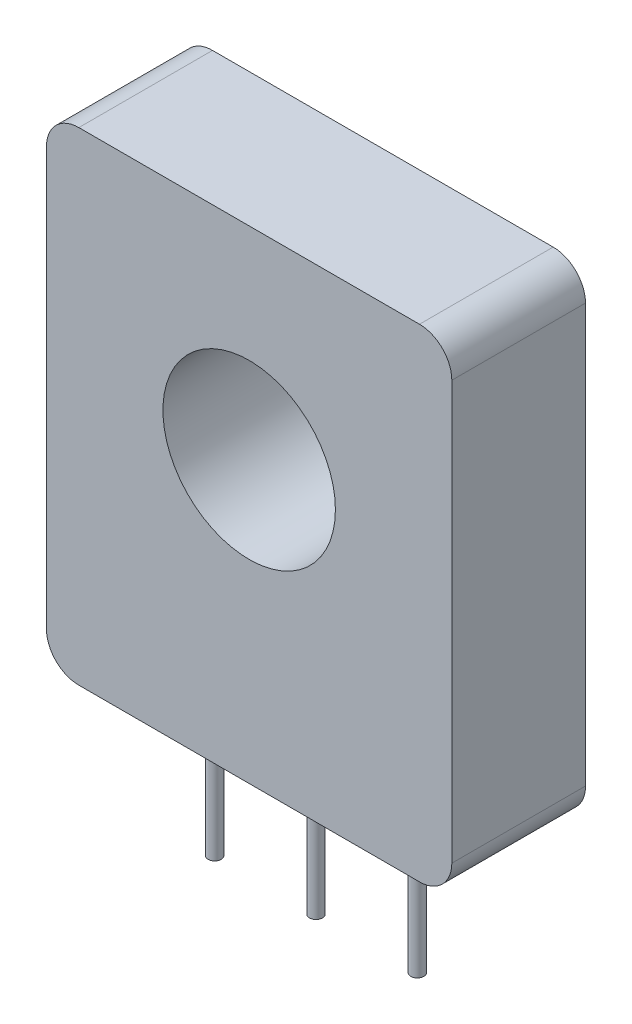
ISO-10303-21;
HEADER;
FILE_DESCRIPTION(('STEP AP214'),'2;1');
FILE_NAME('part.step','',(''),(''),'','','');
FILE_SCHEMA(('AUTOMOTIVE_DESIGN { 1 0 10303 214 1 1 1 1 }'));
ENDSEC;
DATA;
#1=APPLICATION_CONTEXT('core data for automotive mechanical design processes');
#2=APPLICATION_PROTOCOL_DEFINITION('international standard','automotive_design',2000,#1);
#3=PRODUCT_CONTEXT('',#1,'mechanical');
#4=PRODUCT('Part','Part','',(#3));
#5=PRODUCT_RELATED_PRODUCT_CATEGORY('part','',(#4));
#6=PRODUCT_DEFINITION_FORMATION('','',#4);
#7=PRODUCT_DEFINITION_CONTEXT('part definition',#1,'design');
#8=PRODUCT_DEFINITION('design','',#6,#7);
#9=PRODUCT_DEFINITION_SHAPE('','',#8);
#10=(LENGTH_UNIT() NAMED_UNIT(*) SI_UNIT(.MILLI.,.METRE.));
#11=(NAMED_UNIT(*) PLANE_ANGLE_UNIT() SI_UNIT($,.RADIAN.));
#12=(NAMED_UNIT(*) SI_UNIT($,.STERADIAN.) SOLID_ANGLE_UNIT());
#13=UNCERTAINTY_MEASURE_WITH_UNIT(LENGTH_MEASURE(1.E-05),#10,'distance_accuracy_value','');
#14=(GEOMETRIC_REPRESENTATION_CONTEXT(3) GLOBAL_UNCERTAINTY_ASSIGNED_CONTEXT((#13)) GLOBAL_UNIT_ASSIGNED_CONTEXT((#10,
#11,#12)) REPRESENTATION_CONTEXT('',''));
#15=CARTESIAN_POINT('',(0.,0.,0.));
#16=DIRECTION('',(0.,0.,1.));
#17=DIRECTION('',(1.,0.,0.));
#18=AXIS2_PLACEMENT_3D('',#15,#16,#17);
#19=CARTESIAN_POINT('',(0.75,10.45,1.55));
#20=DIRECTION('',(0.,0.,-1.));
#21=DIRECTION('',(-1.,0.,0.));
#22=AXIS2_PLACEMENT_3D('',#19,#20,#21);
#23=CYLINDRICAL_SURFACE('',#22,0.75);
#24=CARTESIAN_POINT('',(0.75,10.45,-1.55));
#25=DIRECTION('',(0.,0.,1.));
#26=DIRECTION('',(-1.,0.,0.));
#27=AXIS2_PLACEMENT_3D('',#24,#25,#26);
#28=CIRCLE('',#27,0.75);
#29=CARTESIAN_POINT('',(0.75,11.2,-1.55));
#30=VERTEX_POINT('',#29);
#31=CARTESIAN_POINT('',(0.,10.45,-1.55));
#32=VERTEX_POINT('',#31);
#33=EDGE_CURVE('E147',#30,#32,#28,.T.);
#34=ORIENTED_EDGE('',*,*,#33,.T.);
#35=DIRECTION('',(0.,0.,-1.));
#36=VECTOR('',#35,1.);
#37=CARTESIAN_POINT('',(0.,10.45,1.55));
#38=LINE('',#37,#36);
#39=CARTESIAN_POINT('',(0.,10.45,1.55));
#40=VERTEX_POINT('',#39);
#41=EDGE_CURVE('E175',#40,#32,#38,.T.);
#42=ORIENTED_EDGE('',*,*,#41,.F.);
#43=CARTESIAN_POINT('',(0.75,10.45,1.55));
#44=DIRECTION('',(0.,0.,1.));
#45=DIRECTION('',(-1.,0.,0.));
#46=AXIS2_PLACEMENT_3D('',#43,#44,#45);
#47=CIRCLE('',#46,0.75);
#48=CARTESIAN_POINT('',(0.75,11.2,1.55));
#49=VERTEX_POINT('',#48);
#50=EDGE_CURVE('E162',#49,#40,#47,.T.);
#51=ORIENTED_EDGE('',*,*,#50,.F.);
#52=DIRECTION('',(0.,0.,-1.));
#53=VECTOR('',#52,1.);
#54=CARTESIAN_POINT('',(0.75,11.2,1.55));
#55=LINE('',#54,#53);
#56=EDGE_CURVE('E143',#49,#30,#55,.T.);
#57=ORIENTED_EDGE('',*,*,#56,.T.);
#58=EDGE_LOOP('',(#34,#42,#51,#57));
#59=FACE_BOUND('',#58,.T.);
#60=ADVANCED_FACE('F50',(#59),#23,.T.);
#61=CARTESIAN_POINT('',(0.,0.750000000000005,1.55));
#62=DIRECTION('',(1.,0.,0.));
#63=DIRECTION('',(0.,0.,-1.));
#64=AXIS2_PLACEMENT_3D('',#61,#62,#63);
#65=PLANE('',#64);
#66=DIRECTION('',(0.,-1.,0.));
#67=VECTOR('',#66,1.);
#68=CARTESIAN_POINT('',(0.,0.750000000000005,-1.55));
#69=LINE('',#68,#67);
#70=CARTESIAN_POINT('',(0.,0.750000000000005,-1.55));
#71=VERTEX_POINT('',#70);
#72=EDGE_CURVE('E150',#32,#71,#69,.T.);
#73=ORIENTED_EDGE('',*,*,#72,.T.);
#74=DIRECTION('',(0.,0.,-1.));
#75=VECTOR('',#74,1.);
#76=CARTESIAN_POINT('',(0.,0.750000000000005,1.55));
#77=LINE('',#76,#75);
#78=CARTESIAN_POINT('',(0.,0.750000000000005,1.55));
#79=VERTEX_POINT('',#78);
#80=EDGE_CURVE('E172',#79,#71,#77,.T.);
#81=ORIENTED_EDGE('',*,*,#80,.F.);
#82=DIRECTION('',(0.,-1.,0.));
#83=VECTOR('',#82,1.);
#84=CARTESIAN_POINT('',(0.,0.750000000000005,1.55));
#85=LINE('',#84,#83);
#86=EDGE_CURVE('E110',#40,#79,#85,.T.);
#87=ORIENTED_EDGE('',*,*,#86,.F.);
#88=ORIENTED_EDGE('',*,*,#41,.T.);
#89=EDGE_LOOP('',(#73,#81,#87,#88));
#90=FACE_BOUND('',#89,.T.);
#91=ADVANCED_FACE('F218',(#90),#65,.F.);
#92=CARTESIAN_POINT('',(0.75,0.75,1.55));
#93=DIRECTION('',(0.,0.,-1.));
#94=DIRECTION('',(-1.,0.,0.));
#95=AXIS2_PLACEMENT_3D('',#92,#93,#94);
#96=CYLINDRICAL_SURFACE('',#95,0.75);
#97=CARTESIAN_POINT('',(0.75,0.75,-1.55));
#98=DIRECTION('',(0.,0.,1.));
#99=DIRECTION('',(-1.,0.,0.));
#100=AXIS2_PLACEMENT_3D('',#97,#98,#99);
#101=CIRCLE('',#100,0.75);
#102=CARTESIAN_POINT('',(0.750000000000005,0.,-1.55));
#103=VERTEX_POINT('',#102);
#104=EDGE_CURVE('E153',#71,#103,#101,.T.);
#105=ORIENTED_EDGE('',*,*,#104,.T.);
#106=DIRECTION('',(0.,0.,-1.));
#107=VECTOR('',#106,1.);
#108=CARTESIAN_POINT('',(0.750000000000005,0.,1.55));
#109=LINE('',#108,#107);
#110=CARTESIAN_POINT('',(0.750000000000005,0.,1.55));
#111=VERTEX_POINT('',#110);
#112=EDGE_CURVE('E169',#111,#103,#109,.T.);
#113=ORIENTED_EDGE('',*,*,#112,.F.);
#114=CARTESIAN_POINT('',(0.75,0.75,1.55));
#115=DIRECTION('',(0.,0.,1.));
#116=DIRECTION('',(-1.,0.,0.));
#117=AXIS2_PLACEMENT_3D('',#114,#115,#116);
#118=CIRCLE('',#117,0.75);
#119=EDGE_CURVE('E356',#79,#111,#118,.T.);
#120=ORIENTED_EDGE('',*,*,#119,.F.);
#121=ORIENTED_EDGE('',*,*,#80,.T.);
#122=EDGE_LOOP('',(#105,#113,#120,#121));
#123=FACE_BOUND('',#122,.T.);
#124=ADVANCED_FACE('F188',(#123),#96,.T.);
#125=CARTESIAN_POINT('',(0.750000000000005,0.,1.55));
#126=DIRECTION('',(0.,1.,0.));
#127=DIRECTION('',(0.,0.,1.));
#128=AXIS2_PLACEMENT_3D('',#125,#126,#127);
#129=PLANE('',#128);
#130=CARTESIAN_POINT('',(7.05,0.,0.));
#131=DIRECTION('',(0.,1.,0.));
#132=DIRECTION('',(0.,0.,1.));
#133=AXIS2_PLACEMENT_3D('',#130,#131,#132);
#134=CIRCLE('',#133,0.15);
#135=CARTESIAN_POINT('',(7.05,0.,0.15));
#136=VERTEX_POINT('',#135);
#137=EDGE_CURVE('E13',#136,#136,#134,.F.);
#138=ORIENTED_EDGE('',*,*,#137,.F.);
#139=EDGE_LOOP('',(#138));
#140=FACE_BOUND('',#139,.T.);
#141=CARTESIAN_POINT('',(4.7,0.,0.));
#142=DIRECTION('',(0.,1.,0.));
#143=DIRECTION('',(0.,0.,1.));
#144=AXIS2_PLACEMENT_3D('',#141,#142,#143);
#145=CIRCLE('',#144,0.15);
#146=CARTESIAN_POINT('',(4.7,0.,0.149999999999999));
#147=VERTEX_POINT('',#146);
#148=EDGE_CURVE('E58',#147,#147,#145,.F.);
#149=ORIENTED_EDGE('',*,*,#148,.F.);
#150=EDGE_LOOP('',(#149));
#151=FACE_BOUND('',#150,.T.);
#152=CARTESIAN_POINT('',(2.35,0.,0.));
#153=DIRECTION('',(0.,1.,0.));
#154=DIRECTION('',(0.,0.,1.));
#155=AXIS2_PLACEMENT_3D('',#152,#153,#154);
#156=CIRCLE('',#155,0.15);
#157=CARTESIAN_POINT('',(2.35,0.,0.15));
#158=VERTEX_POINT('',#157);
#159=EDGE_CURVE('E177',#158,#158,#156,.F.);
#160=ORIENTED_EDGE('',*,*,#159,.F.);
#161=EDGE_LOOP('',(#160));
#162=FACE_BOUND('',#161,.T.);
#163=DIRECTION('',(1.,0.,0.));
#164=VECTOR('',#163,1.);
#165=CARTESIAN_POINT('',(0.750000000000005,0.,-1.55));
#166=LINE('',#165,#164);
#167=CARTESIAN_POINT('',(8.65,0.,-1.55));
#168=VERTEX_POINT('',#167);
#169=EDGE_CURVE('E155',#103,#168,#166,.T.);
#170=ORIENTED_EDGE('',*,*,#169,.T.);
#171=DIRECTION('',(0.,0.,-1.));
#172=VECTOR('',#171,1.);
#173=CARTESIAN_POINT('',(8.65,0.,1.55));
#174=LINE('',#173,#172);
#175=CARTESIAN_POINT('',(8.65,0.,1.55));
#176=VERTEX_POINT('',#175);
#177=EDGE_CURVE('E166',#176,#168,#174,.T.);
#178=ORIENTED_EDGE('',*,*,#177,.F.);
#179=DIRECTION('',(1.,0.,0.));
#180=VECTOR('',#179,1.);
#181=CARTESIAN_POINT('',(0.750000000000005,0.,1.55));
#182=LINE('',#181,#180);
#183=EDGE_CURVE('E358',#111,#176,#182,.T.);
#184=ORIENTED_EDGE('',*,*,#183,.F.);
#185=ORIENTED_EDGE('',*,*,#112,.T.);
#186=EDGE_LOOP('',(#170,#178,#184,#185));
#187=FACE_BOUND('',#186,.T.);
#188=ADVANCED_FACE('F184',(#140,#151,#162,#187),#129,.F.);
#189=CARTESIAN_POINT('',(8.65,0.75,1.55));
#190=DIRECTION('',(0.,0.,-1.));
#191=DIRECTION('',(-1.,0.,0.));
#192=AXIS2_PLACEMENT_3D('',#189,#190,#191);
#193=CYLINDRICAL_SURFACE('',#192,0.75);
#194=CARTESIAN_POINT('',(8.65,0.75,-1.55));
#195=DIRECTION('',(0.,0.,1.));
#196=DIRECTION('',(-1.,0.,0.));
#197=AXIS2_PLACEMENT_3D('',#194,#195,#196);
#198=CIRCLE('',#197,0.75);
#199=CARTESIAN_POINT('',(9.4,0.75,-1.55));
#200=VERTEX_POINT('',#199);
#201=EDGE_CURVE('E157',#168,#200,#198,.T.);
#202=ORIENTED_EDGE('',*,*,#201,.T.);
#203=DIRECTION('',(0.,0.,-1.));
#204=VECTOR('',#203,1.);
#205=CARTESIAN_POINT('',(9.4,0.75,1.55));
#206=LINE('',#205,#204);
#207=CARTESIAN_POINT('',(9.4,0.75,1.55));
#208=VERTEX_POINT('',#207);
#209=EDGE_CURVE('E138',#208,#200,#206,.T.);
#210=ORIENTED_EDGE('',*,*,#209,.F.);
#211=CARTESIAN_POINT('',(8.65,0.75,1.55));
#212=DIRECTION('',(0.,0.,1.));
#213=DIRECTION('',(-1.,0.,0.));
#214=AXIS2_PLACEMENT_3D('',#211,#212,#213);
#215=CIRCLE('',#214,0.75);
#216=EDGE_CURVE('E129',#176,#208,#215,.T.);
#217=ORIENTED_EDGE('',*,*,#216,.F.);
#218=ORIENTED_EDGE('',*,*,#177,.T.);
#219=EDGE_LOOP('',(#202,#210,#217,#218));
#220=FACE_BOUND('',#219,.T.);
#221=ADVANCED_FACE('F187',(#220),#193,.T.);
#222=CARTESIAN_POINT('',(9.4,0.75,1.55));
#223=DIRECTION('',(-1.,0.,0.));
#224=DIRECTION('',(0.,0.,1.));
#225=AXIS2_PLACEMENT_3D('',#222,#223,#224);
#226=PLANE('',#225);
#227=DIRECTION('',(0.,1.,0.));
#228=VECTOR('',#227,1.);
#229=CARTESIAN_POINT('',(9.4,0.75,-1.55));
#230=LINE('',#229,#228);
#231=CARTESIAN_POINT('',(9.4,10.45,-1.55));
#232=VERTEX_POINT('',#231);
#233=EDGE_CURVE('E137',#200,#232,#230,.T.);
#234=ORIENTED_EDGE('',*,*,#233,.T.);
#235=DIRECTION('',(0.,0.,-1.));
#236=VECTOR('',#235,1.);
#237=CARTESIAN_POINT('',(9.4,10.45,1.55));
#238=LINE('',#237,#236);
#239=CARTESIAN_POINT('',(9.4,10.45,1.55));
#240=VERTEX_POINT('',#239);
#241=EDGE_CURVE('E134',#240,#232,#238,.T.);
#242=ORIENTED_EDGE('',*,*,#241,.F.);
#243=DIRECTION('',(0.,1.,0.));
#244=VECTOR('',#243,1.);
#245=CARTESIAN_POINT('',(9.4,0.75,1.55));
#246=LINE('',#245,#244);
#247=EDGE_CURVE('E123',#208,#240,#246,.T.);
#248=ORIENTED_EDGE('',*,*,#247,.F.);
#249=ORIENTED_EDGE('',*,*,#209,.T.);
#250=EDGE_LOOP('',(#234,#242,#248,#249));
#251=FACE_BOUND('',#250,.T.);
#252=ADVANCED_FACE('F135',(#251),#226,.F.);
#253=CARTESIAN_POINT('',(8.65,10.45,1.55));
#254=DIRECTION('',(0.,0.,-1.));
#255=DIRECTION('',(-1.,0.,0.));
#256=AXIS2_PLACEMENT_3D('',#253,#254,#255);
#257=CYLINDRICAL_SURFACE('',#256,0.750000000000001);
#258=CARTESIAN_POINT('',(8.65,10.45,-1.55));
#259=DIRECTION('',(0.,0.,1.));
#260=DIRECTION('',(-1.,0.,0.));
#261=AXIS2_PLACEMENT_3D('',#258,#259,#260);
#262=CIRCLE('',#261,0.750000000000001);
#263=CARTESIAN_POINT('',(8.65,11.2,-1.55));
#264=VERTEX_POINT('',#263);
#265=EDGE_CURVE('E95',#232,#264,#262,.T.);
#266=ORIENTED_EDGE('',*,*,#265,.T.);
#267=DIRECTION('',(0.,0.,-1.));
#268=VECTOR('',#267,1.);
#269=CARTESIAN_POINT('',(8.65,11.2,1.55));
#270=LINE('',#269,#268);
#271=CARTESIAN_POINT('',(8.65,11.2,1.55));
#272=VERTEX_POINT('',#271);
#273=EDGE_CURVE('E139',#272,#264,#270,.T.);
#274=ORIENTED_EDGE('',*,*,#273,.F.);
#275=CARTESIAN_POINT('',(8.65,10.45,1.55));
#276=DIRECTION('',(0.,0.,1.));
#277=DIRECTION('',(-1.,0.,0.));
#278=AXIS2_PLACEMENT_3D('',#275,#276,#277);
#279=CIRCLE('',#278,0.750000000000001);
#280=EDGE_CURVE('E127',#240,#272,#279,.T.);
#281=ORIENTED_EDGE('',*,*,#280,.F.);
#282=ORIENTED_EDGE('',*,*,#241,.T.);
#283=EDGE_LOOP('',(#266,#274,#281,#282));
#284=FACE_BOUND('',#283,.T.);
#285=ADVANCED_FACE('F141',(#284),#257,.T.);
#286=CARTESIAN_POINT('',(0.75,11.2,1.55));
#287=DIRECTION('',(0.,-1.,0.));
#288=DIRECTION('',(0.,0.,-1.));
#289=AXIS2_PLACEMENT_3D('',#286,#287,#288);
#290=PLANE('',#289);
#291=DIRECTION('',(-1.,0.,0.));
#292=VECTOR('',#291,1.);
#293=CARTESIAN_POINT('',(0.75,11.2,-1.55));
#294=LINE('',#293,#292);
#295=EDGE_CURVE('E101',#264,#30,#294,.T.);
#296=ORIENTED_EDGE('',*,*,#295,.T.);
#297=ORIENTED_EDGE('',*,*,#56,.F.);
#298=DIRECTION('',(-1.,0.,0.));
#299=VECTOR('',#298,1.);
#300=CARTESIAN_POINT('',(0.75,11.2,1.55));
#301=LINE('',#300,#299);
#302=EDGE_CURVE('E66',#272,#49,#301,.T.);
#303=ORIENTED_EDGE('',*,*,#302,.F.);
#304=ORIENTED_EDGE('',*,*,#273,.T.);
#305=EDGE_LOOP('',(#296,#297,#303,#304));
#306=FACE_BOUND('',#305,.T.);
#307=ADVANCED_FACE('F206',(#306),#290,.F.);
#308=CARTESIAN_POINT('',(0.75,10.45,1.55));
#309=DIRECTION('',(0.,0.,-1.));
#310=DIRECTION('',(-1.,0.,0.));
#311=AXIS2_PLACEMENT_3D('',#308,#309,#310);
#312=PLANE('',#311);
#313=CARTESIAN_POINT('',(4.7,6.5,1.55));
#314=DIRECTION('',(0.,0.,-1.));
#315=DIRECTION('',(-1.,0.,0.));
#316=AXIS2_PLACEMENT_3D('',#313,#314,#315);
#317=CIRCLE('',#316,2.);
#318=CARTESIAN_POINT('',(6.7,6.5,1.55));
#319=VERTEX_POINT('',#318);
#320=EDGE_CURVE('E151',#319,#319,#317,.T.);
#321=ORIENTED_EDGE('',*,*,#320,.T.);
#322=EDGE_LOOP('',(#321));
#323=FACE_BOUND('',#322,.T.);
#324=ORIENTED_EDGE('',*,*,#50,.T.);
#325=ORIENTED_EDGE('',*,*,#86,.T.);
#326=ORIENTED_EDGE('',*,*,#119,.T.);
#327=ORIENTED_EDGE('',*,*,#183,.T.);
#328=ORIENTED_EDGE('',*,*,#216,.T.);
#329=ORIENTED_EDGE('',*,*,#247,.T.);
#330=ORIENTED_EDGE('',*,*,#280,.T.);
#331=ORIENTED_EDGE('',*,*,#302,.T.);
#332=EDGE_LOOP('',(#324,#325,#326,#327,#328,#329,#330,#331));
#333=FACE_BOUND('',#332,.T.);
#334=ADVANCED_FACE('F125',(#323,#333),#312,.F.);
#335=CARTESIAN_POINT('',(0.75,10.45,-1.55));
#336=DIRECTION('',(0.,0.,-1.));
#337=DIRECTION('',(-1.,0.,0.));
#338=AXIS2_PLACEMENT_3D('',#335,#336,#337);
#339=PLANE('',#338);
#340=CARTESIAN_POINT('',(4.7,6.5,-1.55));
#341=DIRECTION('',(0.,0.,1.));
#342=DIRECTION('',(1.,0.,0.));
#343=AXIS2_PLACEMENT_3D('',#340,#341,#342);
#344=CIRCLE('',#343,2.);
#345=CARTESIAN_POINT('',(6.7,6.5,-1.55));
#346=VERTEX_POINT('',#345);
#347=EDGE_CURVE('E349',#346,#346,#344,.T.);
#348=ORIENTED_EDGE('',*,*,#347,.T.);
#349=EDGE_LOOP('',(#348));
#350=FACE_BOUND('',#349,.T.);
#351=ORIENTED_EDGE('',*,*,#33,.F.);
#352=ORIENTED_EDGE('',*,*,#295,.F.);
#353=ORIENTED_EDGE('',*,*,#265,.F.);
#354=ORIENTED_EDGE('',*,*,#233,.F.);
#355=ORIENTED_EDGE('',*,*,#201,.F.);
#356=ORIENTED_EDGE('',*,*,#169,.F.);
#357=ORIENTED_EDGE('',*,*,#104,.F.);
#358=ORIENTED_EDGE('',*,*,#72,.F.);
#359=EDGE_LOOP('',(#351,#352,#353,#354,#355,#356,#357,#358));
#360=FACE_BOUND('',#359,.T.);
#361=ADVANCED_FACE('F202',(#350,#360),#339,.T.);
#362=CARTESIAN_POINT('',(4.7,6.5,-1.55));
#363=DIRECTION('',(0.,0.,1.));
#364=DIRECTION('',(1.,0.,0.));
#365=AXIS2_PLACEMENT_3D('',#362,#363,#364);
#366=CYLINDRICAL_SURFACE('',#365,2.);
#367=CARTESIAN_POINT('',(6.7,6.5,-1.55));
#368=CARTESIAN_POINT('',(6.7,6.5,-1.51770833333333));
#369=CARTESIAN_POINT('',(6.7,6.5,-1.48541666666667));
#370=CARTESIAN_POINT('',(6.7,6.5,-1.42083333333333));
#371=CARTESIAN_POINT('',(6.7,6.5,-1.38854166666667));
#372=CARTESIAN_POINT('',(6.7,6.5,-1.32395833333333));
#373=CARTESIAN_POINT('',(6.7,6.5,-1.29166666666667));
#374=CARTESIAN_POINT('',(6.7,6.5,-1.22708333333333));
#375=CARTESIAN_POINT('',(6.7,6.5,-1.19479166666667));
#376=CARTESIAN_POINT('',(6.7,6.5,-1.13020833333333));
#377=CARTESIAN_POINT('',(6.7,6.5,-1.09791666666667));
#378=CARTESIAN_POINT('',(6.7,6.5,-1.03333333333333));
#379=CARTESIAN_POINT('',(6.7,6.5,-1.00104166666667));
#380=CARTESIAN_POINT('',(6.7,6.5,-0.936458333333333));
#381=CARTESIAN_POINT('',(6.7,6.5,-0.904166666666667));
#382=CARTESIAN_POINT('',(6.7,6.5,-0.839583333333333));
#383=CARTESIAN_POINT('',(6.7,6.5,-0.807291666666667));
#384=CARTESIAN_POINT('',(6.7,6.5,-0.742708333333333));
#385=CARTESIAN_POINT('',(6.7,6.5,-0.710416666666667));
#386=CARTESIAN_POINT('',(6.7,6.5,-0.645833333333333));
#387=CARTESIAN_POINT('',(6.7,6.5,-0.613541666666667));
#388=CARTESIAN_POINT('',(6.7,6.5,-0.548958333333333));
#389=CARTESIAN_POINT('',(6.7,6.5,-0.516666666666667));
#390=CARTESIAN_POINT('',(6.7,6.5,-0.452083333333333));
#391=CARTESIAN_POINT('',(6.7,6.5,-0.419791666666667));
#392=CARTESIAN_POINT('',(6.7,6.5,-0.355208333333333));
#393=CARTESIAN_POINT('',(6.7,6.5,-0.322916666666667));
#394=CARTESIAN_POINT('',(6.7,6.5,-0.258333333333333));
#395=CARTESIAN_POINT('',(6.7,6.5,-0.226041666666667));
#396=CARTESIAN_POINT('',(6.7,6.5,-0.161458333333333));
#397=CARTESIAN_POINT('',(6.7,6.5,-0.129166666666667));
#398=CARTESIAN_POINT('',(6.7,6.5,-0.0645833333333333));
#399=CARTESIAN_POINT('',(6.7,6.5,-0.0322916666666667));
#400=CARTESIAN_POINT('',(6.7,6.5,0.0322916666666667));
#401=CARTESIAN_POINT('',(6.7,6.5,0.0645833333333333));
#402=CARTESIAN_POINT('',(6.7,6.5,0.129166666666667));
#403=CARTESIAN_POINT('',(6.7,6.5,0.161458333333333));
#404=CARTESIAN_POINT('',(6.7,6.5,0.226041666666667));
#405=CARTESIAN_POINT('',(6.7,6.5,0.258333333333333));
#406=CARTESIAN_POINT('',(6.7,6.5,0.322916666666667));
#407=CARTESIAN_POINT('',(6.7,6.5,0.355208333333333));
#408=CARTESIAN_POINT('',(6.7,6.5,0.419791666666667));
#409=CARTESIAN_POINT('',(6.7,6.5,0.452083333333333));
#410=CARTESIAN_POINT('',(6.7,6.5,0.516666666666666));
#411=CARTESIAN_POINT('',(6.7,6.5,0.548958333333333));
#412=CARTESIAN_POINT('',(6.7,6.5,0.613541666666667));
#413=CARTESIAN_POINT('',(6.7,6.5,0.645833333333333));
#414=CARTESIAN_POINT('',(6.7,6.5,0.710416666666666));
#415=CARTESIAN_POINT('',(6.7,6.5,0.742708333333333));
#416=CARTESIAN_POINT('',(6.7,6.5,0.807291666666667));
#417=CARTESIAN_POINT('',(6.7,6.5,0.839583333333333));
#418=CARTESIAN_POINT('',(6.7,6.5,0.904166666666667));
#419=CARTESIAN_POINT('',(6.7,6.5,0.936458333333333));
#420=CARTESIAN_POINT('',(6.7,6.5,1.00104166666667));
#421=CARTESIAN_POINT('',(6.7,6.5,1.03333333333333));
#422=CARTESIAN_POINT('',(6.7,6.5,1.09791666666667));
#423=CARTESIAN_POINT('',(6.7,6.5,1.13020833333333));
#424=CARTESIAN_POINT('',(6.7,6.5,1.19479166666667));
#425=CARTESIAN_POINT('',(6.7,6.5,1.22708333333333));
#426=CARTESIAN_POINT('',(6.7,6.5,1.29166666666667));
#427=CARTESIAN_POINT('',(6.7,6.5,1.32395833333333));
#428=CARTESIAN_POINT('',(6.7,6.5,1.38854166666667));
#429=CARTESIAN_POINT('',(6.7,6.5,1.42083333333333));
#430=CARTESIAN_POINT('',(6.7,6.5,1.48541666666667));
#431=CARTESIAN_POINT('',(6.7,6.5,1.51770833333333));
#432=CARTESIAN_POINT('',(6.7,6.5,1.55));
#433=B_SPLINE_CURVE_WITH_KNOTS('',3,(#367,#368,#369,#370,#371,#372,#373,#374,#375,#376,#377,
#378,#379,#380,#381,#382,#383,#384,#385,#386,#387,#388,#389,#390,#391,#392,#393,#394,#395,#396,
#397,#398,#399,#400,#401,#402,#403,#404,#405,#406,#407,#408,#409,#410,#411,#412,#413,#414,#415,
#416,#417,#418,#419,#420,#421,#422,#423,#424,#425,#426,#427,#428,#429,#430,#431,#432),
.UNSPECIFIED.,.F.,.F.,(4,2,2,2,2,2,2,2,2,2,2,2,2,2,2,2,2,2,2,2,2,2,2,2,2,2,2,2,2,2,2,2,4),(0.,
0.096875,0.19375,0.290625,0.3875,0.484375,0.58125,0.678125,0.775,0.871875,0.96875,1.065625,
1.1625,1.259375,1.35625,1.453125,1.55,1.646875,1.74375,1.840625,1.9375,2.034375,2.13125,
2.228125,2.325,2.421875,2.51875,2.615625,2.7125,2.809375,2.90625,3.003125,3.1),.UNSPECIFIED.);
#434=EDGE_CURVE('BSEAM258',#346,#319,#433,.T.);
#435=ORIENTED_EDGE('',*,*,#347,.F.);
#436=ORIENTED_EDGE('',*,*,#320,.F.);
#437=ORIENTED_EDGE('',*,*,#434,.T.);
#438=ORIENTED_EDGE('',*,*,#434,.F.);
#439=EDGE_LOOP('',(#435,#437,#436,#438));
#440=FACE_BOUND('',#439,.T.);
#441=ADVANCED_FACE('F258',(#440),#366,.F.);
#442=CARTESIAN_POINT('',(2.35,-3.4,0.));
#443=DIRECTION('',(0.,1.,0.));
#444=DIRECTION('',(0.,0.,1.));
#445=AXIS2_PLACEMENT_3D('',#442,#443,#444);
#446=CYLINDRICAL_SURFACE('',#445,0.15);
#447=CARTESIAN_POINT('',(2.35,-3.4,0.));
#448=DIRECTION('',(0.,-1.,0.));
#449=DIRECTION('',(0.,0.,-1.));
#450=AXIS2_PLACEMENT_3D('',#447,#448,#449);
#451=CIRCLE('',#450,0.15);
#452=CARTESIAN_POINT('',(2.35,-3.4,-0.15));
#453=VERTEX_POINT('',#452);
#454=EDGE_CURVE('E344',#453,#453,#451,.T.);
#455=ORIENTED_EDGE('',*,*,#454,.F.);
#456=EDGE_LOOP('',(#455));
#457=FACE_BOUND('',#456,.T.);
#458=ORIENTED_EDGE('',*,*,#159,.T.);
#459=EDGE_LOOP('',(#458));
#460=FACE_BOUND('',#459,.T.);
#461=ADVANCED_FACE('F267',(#457,#460),#446,.T.);
#462=CARTESIAN_POINT('',(2.35,-3.4,0.));
#463=DIRECTION('',(0.,-1.,0.));
#464=DIRECTION('',(0.,0.,-1.));
#465=AXIS2_PLACEMENT_3D('',#462,#463,#464);
#466=PLANE('',#465);
#467=ORIENTED_EDGE('',*,*,#454,.T.);
#468=EDGE_LOOP('',(#467));
#469=FACE_BOUND('',#468,.T.);
#470=ADVANCED_FACE('F285',(#469),#466,.T.);
#471=CARTESIAN_POINT('',(4.7,-3.4,0.));
#472=DIRECTION('',(0.,1.,0.));
#473=DIRECTION('',(0.,0.,1.));
#474=AXIS2_PLACEMENT_3D('',#471,#472,#473);
#475=CYLINDRICAL_SURFACE('',#474,0.15);
#476=CARTESIAN_POINT('',(4.7,-3.4,0.));
#477=DIRECTION('',(0.,-1.,0.));
#478=DIRECTION('',(0.,0.,-1.));
#479=AXIS2_PLACEMENT_3D('',#476,#477,#478);
#480=CIRCLE('',#479,0.15);
#481=CARTESIAN_POINT('',(4.7,-3.4,-0.150000000000001));
#482=VERTEX_POINT('',#481);
#483=EDGE_CURVE('E341',#482,#482,#480,.T.);
#484=ORIENTED_EDGE('',*,*,#483,.F.);
#485=EDGE_LOOP('',(#484));
#486=FACE_BOUND('',#485,.T.);
#487=ORIENTED_EDGE('',*,*,#148,.T.);
#488=EDGE_LOOP('',(#487));
#489=FACE_BOUND('',#488,.T.);
#490=ADVANCED_FACE('F182',(#486,#489),#475,.T.);
#491=CARTESIAN_POINT('',(4.7,-3.4,0.));
#492=DIRECTION('',(0.,-1.,0.));
#493=DIRECTION('',(0.,0.,-1.));
#494=AXIS2_PLACEMENT_3D('',#491,#492,#493);
#495=PLANE('',#494);
#496=ORIENTED_EDGE('',*,*,#483,.T.);
#497=EDGE_LOOP('',(#496));
#498=FACE_BOUND('',#497,.T.);
#499=ADVANCED_FACE('F304',(#498),#495,.T.);
#500=CARTESIAN_POINT('',(7.05,-3.4,0.));
#501=DIRECTION('',(0.,1.,0.));
#502=DIRECTION('',(0.,0.,1.));
#503=AXIS2_PLACEMENT_3D('',#500,#501,#502);
#504=CYLINDRICAL_SURFACE('',#503,0.15);
#505=CARTESIAN_POINT('',(7.05,-3.4,0.));
#506=DIRECTION('',(0.,-1.,0.));
#507=DIRECTION('',(0.,0.,-1.));
#508=AXIS2_PLACEMENT_3D('',#505,#506,#507);
#509=CIRCLE('',#508,0.15);
#510=CARTESIAN_POINT('',(7.05,-3.4,-0.15));
#511=VERTEX_POINT('',#510);
#512=EDGE_CURVE('E340',#511,#511,#509,.T.);
#513=ORIENTED_EDGE('',*,*,#512,.F.);
#514=EDGE_LOOP('',(#513));
#515=FACE_BOUND('',#514,.T.);
#516=ORIENTED_EDGE('',*,*,#137,.T.);
#517=EDGE_LOOP('',(#516));
#518=FACE_BOUND('',#517,.T.);
#519=ADVANCED_FACE('F314',(#515,#518),#504,.T.);
#520=CARTESIAN_POINT('',(7.05,-3.4,0.));
#521=DIRECTION('',(0.,-1.,0.));
#522=DIRECTION('',(0.,0.,-1.));
#523=AXIS2_PLACEMENT_3D('',#520,#521,#522);
#524=PLANE('',#523);
#525=ORIENTED_EDGE('',*,*,#512,.T.);
#526=EDGE_LOOP('',(#525));
#527=FACE_BOUND('',#526,.T.);
#528=ADVANCED_FACE('F324',(#527),#524,.T.);
#529=CLOSED_SHELL('',(#60,#91,#124,#188,#221,#252,#285,#307,#334,#361,#441,#461,#470,#490,#499,
#519,#528));
#530=MANIFOLD_SOLID_BREP('B2',#529);
#531=ADVANCED_BREP_SHAPE_REPRESENTATION('',(#18,#530),#14);
#532=SHAPE_DEFINITION_REPRESENTATION(#9,#531);
ENDSEC;
END-ISO-10303-21;
